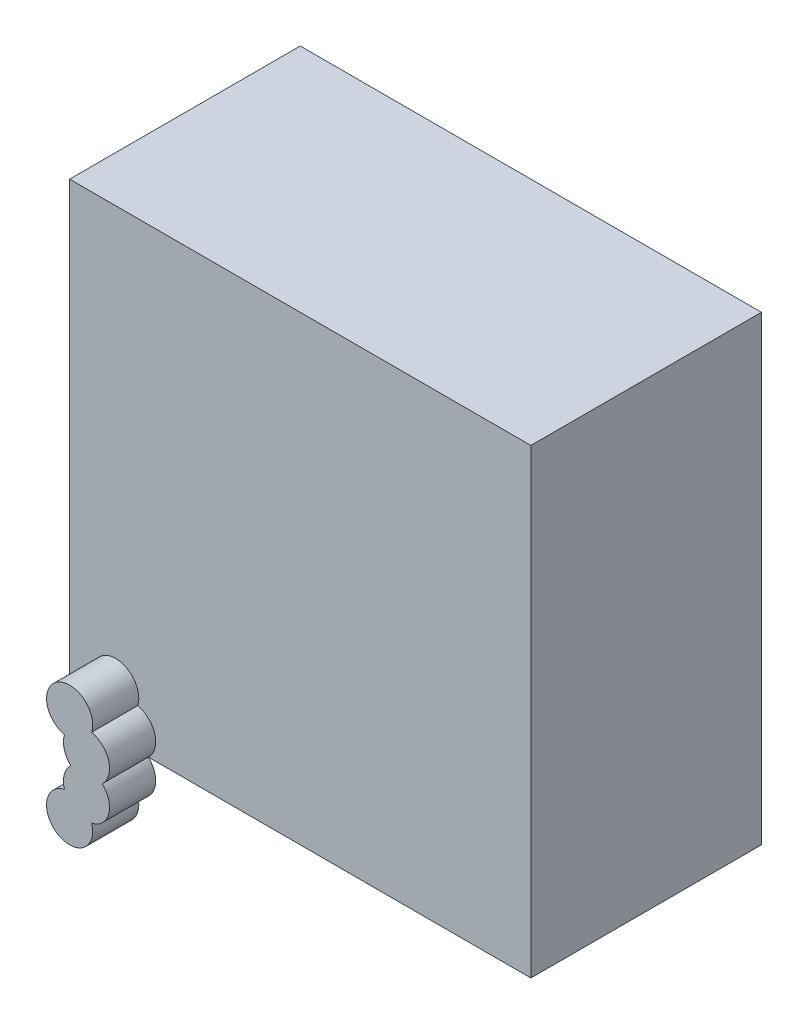
ISO-10303-21;
HEADER;
FILE_DESCRIPTION(('STEP AP214'),'2;1');
FILE_NAME('part.step','',(''),(''),'','','');
FILE_SCHEMA(('AUTOMOTIVE_DESIGN { 1 0 10303 214 1 1 1 1 }'));
ENDSEC;
DATA;
#1=APPLICATION_CONTEXT('core data for automotive mechanical design processes');
#2=APPLICATION_PROTOCOL_DEFINITION('international standard','automotive_design',2000,#1);
#3=PRODUCT_CONTEXT('',#1,'mechanical');
#4=PRODUCT('Part','Part','',(#3));
#5=PRODUCT_RELATED_PRODUCT_CATEGORY('part','',(#4));
#6=PRODUCT_DEFINITION_FORMATION('','',#4);
#7=PRODUCT_DEFINITION_CONTEXT('part definition',#1,'design');
#8=PRODUCT_DEFINITION('design','',#6,#7);
#9=PRODUCT_DEFINITION_SHAPE('','',#8);
#10=(LENGTH_UNIT() NAMED_UNIT(*) SI_UNIT(.MILLI.,.METRE.));
#11=(NAMED_UNIT(*) PLANE_ANGLE_UNIT() SI_UNIT($,.RADIAN.));
#12=(NAMED_UNIT(*) SI_UNIT($,.STERADIAN.) SOLID_ANGLE_UNIT());
#13=UNCERTAINTY_MEASURE_WITH_UNIT(LENGTH_MEASURE(1.E-05),#10,'distance_accuracy_value','');
#14=(GEOMETRIC_REPRESENTATION_CONTEXT(3) GLOBAL_UNCERTAINTY_ASSIGNED_CONTEXT((#13)) GLOBAL_UNIT_ASSIGNED_CONTEXT((#10,
#11,#12)) REPRESENTATION_CONTEXT('',''));
#15=CARTESIAN_POINT('',(0.,0.,0.));
#16=DIRECTION('',(0.,0.,1.));
#17=DIRECTION('',(1.,0.,0.));
#18=AXIS2_PLACEMENT_3D('',#15,#16,#17);
#19=CARTESIAN_POINT('',(2.,2.,12.));
#20=DIRECTION('',(0.,0.,-1.));
#21=DIRECTION('',(-1.,0.,0.));
#22=AXIS2_PLACEMENT_3D('',#19,#20,#21);
#23=CYLINDRICAL_SURFACE('',#22,1.);
#24=DIRECTION('',(0.,0.,-1.));
#25=VECTOR('',#24,1.);
#26=CARTESIAN_POINT('',(1.77604556399895,1.02540038446783,11.));
#27=LINE('',#26,#25);
#28=CARTESIAN_POINT('',(1.77604556399895,1.02540038446783,12.));
#29=VERTEX_POINT('',#28);
#30=CARTESIAN_POINT('',(1.77604556399895,1.02540038446783,10.));
#31=VERTEX_POINT('',#30);
#32=EDGE_CURVE('E170',#29,#31,#27,.T.);
#33=ORIENTED_EDGE('',*,*,#32,.F.);
#34=CARTESIAN_POINT('',(2.,2.,12.));
#35=DIRECTION('',(0.,0.,1.));
#36=DIRECTION('',(1.,0.,0.));
#37=AXIS2_PLACEMENT_3D('',#34,#35,#36);
#38=CIRCLE('',#37,1.);
#39=CARTESIAN_POINT('',(2.95600524356993,1.70665042310105,12.));
#40=VERTEX_POINT('',#39);
#41=EDGE_CURVE('E168',#40,#29,#38,.T.);
#42=ORIENTED_EDGE('',*,*,#41,.F.);
#43=DIRECTION('',(0.,0.,-1.));
#44=VECTOR('',#43,1.);
#45=CARTESIAN_POINT('',(2.95600524356993,1.70665042310105,11.));
#46=LINE('',#45,#44);
#47=CARTESIAN_POINT('',(2.95600524356993,1.70665042310105,10.));
#48=VERTEX_POINT('',#47);
#49=EDGE_CURVE('E165',#48,#40,#46,.F.);
#50=ORIENTED_EDGE('',*,*,#49,.F.);
#51=CARTESIAN_POINT('',(2.,2.,10.));
#52=DIRECTION('',(0.,0.,1.));
#53=DIRECTION('',(1.,0.,0.));
#54=AXIS2_PLACEMENT_3D('',#51,#52,#53);
#55=CIRCLE('',#54,1.);
#56=EDGE_CURVE('E11',#48,#31,#55,.T.);
#57=ORIENTED_EDGE('',*,*,#56,.T.);
#58=EDGE_LOOP('',(#33,#42,#50,#57));
#59=FACE_BOUND('',#58,.T.);
#60=ADVANCED_FACE('F45',(#59),#23,.T.);
#61=CARTESIAN_POINT('',(0.,0.,10.));
#62=DIRECTION('',(1.,0.,0.));
#63=DIRECTION('',(0.,0.,-1.));
#64=AXIS2_PLACEMENT_3D('',#61,#62,#63);
#65=PLANE('',#64);
#66=DIRECTION('',(0.,-1.,0.));
#67=VECTOR('',#66,1.);
#68=CARTESIAN_POINT('',(0.,0.,0.));
#69=LINE('',#68,#67);
#70=CARTESIAN_POINT('',(0.,20.,0.));
#71=VERTEX_POINT('',#70);
#72=CARTESIAN_POINT('',(0.,0.,0.));
#73=VERTEX_POINT('',#72);
#74=EDGE_CURVE('E171',#71,#73,#69,.T.);
#75=ORIENTED_EDGE('',*,*,#74,.T.);
#76=DIRECTION('',(0.,0.,-1.));
#77=VECTOR('',#76,1.);
#78=CARTESIAN_POINT('',(0.,0.,10.));
#79=LINE('',#78,#77);
#80=CARTESIAN_POINT('',(0.,0.,10.));
#81=VERTEX_POINT('',#80);
#82=EDGE_CURVE('E46',#81,#73,#79,.T.);
#83=ORIENTED_EDGE('',*,*,#82,.F.);
#84=DIRECTION('',(0.,-1.,0.));
#85=VECTOR('',#84,1.);
#86=CARTESIAN_POINT('',(0.,0.,10.));
#87=LINE('',#86,#85);
#88=CARTESIAN_POINT('',(0.,20.,10.));
#89=VERTEX_POINT('',#88);
#90=EDGE_CURVE('E174',#89,#81,#87,.T.);
#91=ORIENTED_EDGE('',*,*,#90,.F.);
#92=DIRECTION('',(0.,0.,-1.));
#93=VECTOR('',#92,1.);
#94=CARTESIAN_POINT('',(0.,20.,10.));
#95=LINE('',#94,#93);
#96=EDGE_CURVE('E184',#89,#71,#95,.T.);
#97=ORIENTED_EDGE('',*,*,#96,.T.);
#98=EDGE_LOOP('',(#75,#83,#91,#97));
#99=FACE_BOUND('',#98,.T.);
#100=ADVANCED_FACE('F42',(#99),#65,.F.);
#101=CARTESIAN_POINT('',(0.,0.,10.));
#102=DIRECTION('',(0.,1.,0.));
#103=DIRECTION('',(0.,0.,1.));
#104=AXIS2_PLACEMENT_3D('',#101,#102,#103);
#105=PLANE('',#104);
#106=DIRECTION('',(1.,0.,0.));
#107=VECTOR('',#106,1.);
#108=CARTESIAN_POINT('',(0.,0.,0.));
#109=LINE('',#108,#107);
#110=CARTESIAN_POINT('',(20.,0.,0.));
#111=VERTEX_POINT('',#110);
#112=EDGE_CURVE('E189',#73,#111,#109,.T.);
#113=ORIENTED_EDGE('',*,*,#112,.T.);
#114=DIRECTION('',(0.,0.,-1.));
#115=VECTOR('',#114,1.);
#116=CARTESIAN_POINT('',(20.,0.,10.));
#117=LINE('',#116,#115);
#118=CARTESIAN_POINT('',(20.,0.,10.));
#119=VERTEX_POINT('',#118);
#120=EDGE_CURVE('E198',#119,#111,#117,.T.);
#121=ORIENTED_EDGE('',*,*,#120,.F.);
#122=DIRECTION('',(1.,0.,0.));
#123=VECTOR('',#122,1.);
#124=CARTESIAN_POINT('',(0.,0.,10.));
#125=LINE('',#124,#123);
#126=CARTESIAN_POINT('',(3.41330084620209,0.,10.));
#127=VERTEX_POINT('',#126);
#128=EDGE_CURVE('E176',#127,#119,#125,.T.);
#129=ORIENTED_EDGE('',*,*,#128,.F.);
#130=CARTESIAN_POINT('',(2.05080076893566,0.,10.));
#131=VERTEX_POINT('',#130);
#132=EDGE_CURVE('E65',#131,#127,#125,.T.);
#133=ORIENTED_EDGE('',*,*,#132,.F.);
#134=EDGE_CURVE('E178',#81,#131,#125,.T.);
#135=ORIENTED_EDGE('',*,*,#134,.F.);
#136=ORIENTED_EDGE('',*,*,#82,.T.);
#137=EDGE_LOOP('',(#113,#121,#129,#133,#135,#136));
#138=FACE_BOUND('',#137,.T.);
#139=ADVANCED_FACE('F204',(#138),#105,.F.);
#140=CARTESIAN_POINT('',(20.,0.,10.));
#141=DIRECTION('',(-1.,0.,0.));
#142=DIRECTION('',(0.,0.,1.));
#143=AXIS2_PLACEMENT_3D('',#140,#141,#142);
#144=PLANE('',#143);
#145=DIRECTION('',(0.,1.,0.));
#146=VECTOR('',#145,1.);
#147=CARTESIAN_POINT('',(20.,0.,0.));
#148=LINE('',#147,#146);
#149=CARTESIAN_POINT('',(20.,20.,0.));
#150=VERTEX_POINT('',#149);
#151=EDGE_CURVE('E190',#111,#150,#148,.T.);
#152=ORIENTED_EDGE('',*,*,#151,.T.);
#153=DIRECTION('',(0.,0.,-1.));
#154=VECTOR('',#153,1.);
#155=CARTESIAN_POINT('',(20.,20.,10.));
#156=LINE('',#155,#154);
#157=CARTESIAN_POINT('',(20.,20.,10.));
#158=VERTEX_POINT('',#157);
#159=EDGE_CURVE('E194',#158,#150,#156,.T.);
#160=ORIENTED_EDGE('',*,*,#159,.F.);
#161=DIRECTION('',(0.,1.,0.));
#162=VECTOR('',#161,1.);
#163=CARTESIAN_POINT('',(20.,0.,10.));
#164=LINE('',#163,#162);
#165=EDGE_CURVE('E179',#119,#158,#164,.T.);
#166=ORIENTED_EDGE('',*,*,#165,.F.);
#167=ORIENTED_EDGE('',*,*,#120,.T.);
#168=EDGE_LOOP('',(#152,#160,#166,#167));
#169=FACE_BOUND('',#168,.T.);
#170=ADVANCED_FACE('F213',(#169),#144,.F.);
#171=CARTESIAN_POINT('',(0.,20.,10.));
#172=DIRECTION('',(0.,-1.,0.));
#173=DIRECTION('',(0.,0.,-1.));
#174=AXIS2_PLACEMENT_3D('',#171,#172,#173);
#175=PLANE('',#174);
#176=DIRECTION('',(-1.,0.,0.));
#177=VECTOR('',#176,1.);
#178=CARTESIAN_POINT('',(0.,20.,0.));
#179=LINE('',#178,#177);
#180=EDGE_CURVE('E180',#150,#71,#179,.T.);
#181=ORIENTED_EDGE('',*,*,#180,.T.);
#182=ORIENTED_EDGE('',*,*,#96,.F.);
#183=DIRECTION('',(-1.,0.,0.));
#184=VECTOR('',#183,1.);
#185=CARTESIAN_POINT('',(0.,20.,10.));
#186=LINE('',#185,#184);
#187=EDGE_CURVE('E185',#158,#89,#186,.T.);
#188=ORIENTED_EDGE('',*,*,#187,.F.);
#189=ORIENTED_EDGE('',*,*,#159,.T.);
#190=EDGE_LOOP('',(#181,#182,#188,#189));
#191=FACE_BOUND('',#190,.T.);
#192=ADVANCED_FACE('F216',(#191),#175,.F.);
#193=CARTESIAN_POINT('',(0.,0.,10.));
#194=DIRECTION('',(0.,0.,-1.));
#195=DIRECTION('',(-1.,0.,0.));
#196=AXIS2_PLACEMENT_3D('',#193,#194,#195);
#197=PLANE('',#196);
#198=CARTESIAN_POINT('',(2.73205080756888,0.732050807568878,10.));
#199=DIRECTION('',(0.,0.,1.));
#200=DIRECTION('',(0.866025403784439,-0.5,0.));
#201=AXIS2_PLACEMENT_3D('',#198,#199,#200);
#202=CIRCLE('',#201,1.);
#203=EDGE_CURVE('E59',#127,#48,#202,.T.);
#204=ORIENTED_EDGE('',*,*,#203,.F.);
#205=ORIENTED_EDGE('',*,*,#128,.T.);
#206=ORIENTED_EDGE('',*,*,#165,.T.);
#207=ORIENTED_EDGE('',*,*,#187,.T.);
#208=ORIENTED_EDGE('',*,*,#90,.T.);
#209=ORIENTED_EDGE('',*,*,#134,.T.);
#210=EDGE_CURVE('E157',#31,#131,#202,.T.);
#211=ORIENTED_EDGE('',*,*,#210,.F.);
#212=ORIENTED_EDGE('',*,*,#56,.F.);
#213=EDGE_LOOP('',(#204,#205,#206,#207,#208,#209,#211,#212));
#214=FACE_BOUND('',#213,.T.);
#215=ADVANCED_FACE('F220',(#214),#197,.F.);
#216=CARTESIAN_POINT('',(0.,0.,0.));
#217=DIRECTION('',(0.,0.,-1.));
#218=DIRECTION('',(-1.,0.,0.));
#219=AXIS2_PLACEMENT_3D('',#216,#217,#218);
#220=PLANE('',#219);
#221=ORIENTED_EDGE('',*,*,#74,.F.);
#222=ORIENTED_EDGE('',*,*,#180,.F.);
#223=ORIENTED_EDGE('',*,*,#151,.F.);
#224=ORIENTED_EDGE('',*,*,#112,.F.);
#225=EDGE_LOOP('',(#221,#222,#223,#224));
#226=FACE_BOUND('',#225,.T.);
#227=ADVANCED_FACE('F211',(#226),#220,.T.);
#228=CARTESIAN_POINT('',(2.,2.,12.));
#229=DIRECTION('',(0.,0.,1.));
#230=DIRECTION('',(1.,0.,0.));
#231=AXIS2_PLACEMENT_3D('',#228,#229,#230);
#232=PLANE('',#231);
#233=ORIENTED_EDGE('',*,*,#41,.T.);
#234=CARTESIAN_POINT('',(2.73205080756888,0.732050807568878,12.));
#235=DIRECTION('',(0.,0.,1.));
#236=DIRECTION('',(0.866025403784439,-0.5,0.));
#237=AXIS2_PLACEMENT_3D('',#234,#235,#236);
#238=CIRCLE('',#237,1.);
#239=CARTESIAN_POINT('',(2.05080076893566,0.,12.));
#240=VERTEX_POINT('',#239);
#241=EDGE_CURVE('E162',#29,#240,#238,.T.);
#242=ORIENTED_EDGE('',*,*,#241,.T.);
#243=CARTESIAN_POINT('',(2.73205080756888,-0.732050807568877,12.));
#244=DIRECTION('',(0.,0.,1.));
#245=DIRECTION('',(0.5,-0.866025403784439,0.));
#246=AXIS2_PLACEMENT_3D('',#243,#244,#245);
#247=CIRCLE('',#246,1.);
#248=CARTESIAN_POINT('',(1.77604556399895,-1.02540038446783,12.));
#249=VERTEX_POINT('',#248);
#250=EDGE_CURVE('E134',#240,#249,#247,.T.);
#251=ORIENTED_EDGE('',*,*,#250,.T.);
#252=CARTESIAN_POINT('',(2.,-2.,12.));
#253=DIRECTION('',(0.,0.,1.));
#254=DIRECTION('',(0.,-1.,0.));
#255=AXIS2_PLACEMENT_3D('',#252,#253,#254);
#256=CIRCLE('',#255,1.);
#257=CARTESIAN_POINT('',(2.95600524356993,-1.70665042310104,12.));
#258=VERTEX_POINT('',#257);
#259=EDGE_CURVE('E139',#249,#258,#256,.T.);
#260=ORIENTED_EDGE('',*,*,#259,.T.);
#261=CARTESIAN_POINT('',(3.41330084620209,0.,12.));
#262=VERTEX_POINT('',#261);
#263=EDGE_CURVE('E121',#258,#262,#247,.T.);
#264=ORIENTED_EDGE('',*,*,#263,.T.);
#265=EDGE_CURVE('E159',#262,#40,#238,.T.);
#266=ORIENTED_EDGE('',*,*,#265,.T.);
#267=EDGE_LOOP('',(#233,#242,#251,#260,#264,#266));
#268=FACE_BOUND('',#267,.T.);
#269=ADVANCED_FACE('F144',(#268),#232,.T.);
#270=CARTESIAN_POINT('',(2.73205080756888,0.732050807568878,12.));
#271=DIRECTION('',(0.,0.,-1.));
#272=DIRECTION('',(-1.,0.,0.));
#273=AXIS2_PLACEMENT_3D('',#270,#271,#272);
#274=CYLINDRICAL_SURFACE('',#273,1.);
#275=ORIENTED_EDGE('',*,*,#241,.F.);
#276=ORIENTED_EDGE('',*,*,#32,.T.);
#277=ORIENTED_EDGE('',*,*,#210,.T.);
#278=DIRECTION('',(0.,0.,-1.));
#279=VECTOR('',#278,1.);
#280=CARTESIAN_POINT('',(2.05080076893566,0.,11.));
#281=LINE('',#280,#279);
#282=EDGE_CURVE('E156',#240,#131,#281,.T.);
#283=ORIENTED_EDGE('',*,*,#282,.F.);
#284=EDGE_LOOP('',(#275,#276,#277,#283));
#285=FACE_BOUND('',#284,.T.);
#286=ADVANCED_FACE('F227',(#285),#274,.T.);
#287=ORIENTED_EDGE('',*,*,#203,.T.);
#288=ORIENTED_EDGE('',*,*,#49,.T.);
#289=ORIENTED_EDGE('',*,*,#265,.F.);
#290=DIRECTION('',(0.,0.,-1.));
#291=VECTOR('',#290,1.);
#292=CARTESIAN_POINT('',(3.41330084620209,0.,11.));
#293=LINE('',#292,#291);
#294=EDGE_CURVE('E126',#127,#262,#293,.F.);
#295=ORIENTED_EDGE('',*,*,#294,.F.);
#296=EDGE_LOOP('',(#287,#288,#289,#295));
#297=FACE_BOUND('',#296,.T.);
#298=ADVANCED_FACE('F225',(#297),#274,.T.);
#299=CARTESIAN_POINT('',(2.73205080756888,0.732050807568878,10.));
#300=DIRECTION('',(0.,0.,1.));
#301=DIRECTION('',(0.866025403784439,-0.5,0.));
#302=AXIS2_PLACEMENT_3D('',#299,#300,#301);
#303=PLANE('',#302);
#304=CARTESIAN_POINT('',(2.73205080756888,-0.732050807568877,10.));
#305=DIRECTION('',(0.,0.,1.));
#306=DIRECTION('',(0.5,-0.866025403784439,0.));
#307=AXIS2_PLACEMENT_3D('',#304,#305,#306);
#308=CIRCLE('',#307,1.);
#309=CARTESIAN_POINT('',(1.77604556399895,-1.02540038446783,10.));
#310=VERTEX_POINT('',#309);
#311=EDGE_CURVE('E151',#131,#310,#308,.T.);
#312=ORIENTED_EDGE('',*,*,#311,.F.);
#313=ORIENTED_EDGE('',*,*,#132,.T.);
#314=CARTESIAN_POINT('',(2.95600524356993,-1.70665042310104,10.));
#315=VERTEX_POINT('',#314);
#316=EDGE_CURVE('E153',#315,#127,#308,.T.);
#317=ORIENTED_EDGE('',*,*,#316,.F.);
#318=CARTESIAN_POINT('',(2.,-2.,10.));
#319=DIRECTION('',(0.,0.,1.));
#320=DIRECTION('',(0.,-1.,0.));
#321=AXIS2_PLACEMENT_3D('',#318,#319,#320);
#322=CIRCLE('',#321,1.);
#323=EDGE_CURVE('E143',#310,#315,#322,.T.);
#324=ORIENTED_EDGE('',*,*,#323,.F.);
#325=EDGE_LOOP('',(#312,#313,#317,#324));
#326=FACE_BOUND('',#325,.T.);
#327=ADVANCED_FACE('F219',(#326),#303,.F.);
#328=CARTESIAN_POINT('',(2.73205080756888,-0.732050807568877,12.));
#329=DIRECTION('',(0.,0.,-1.));
#330=DIRECTION('',(-1.,0.,0.));
#331=AXIS2_PLACEMENT_3D('',#328,#329,#330);
#332=CYLINDRICAL_SURFACE('',#331,1.);
#333=ORIENTED_EDGE('',*,*,#250,.F.);
#334=ORIENTED_EDGE('',*,*,#282,.T.);
#335=ORIENTED_EDGE('',*,*,#311,.T.);
#336=DIRECTION('',(0.,0.,-1.));
#337=VECTOR('',#336,1.);
#338=CARTESIAN_POINT('',(1.77604556399895,-1.02540038446783,11.));
#339=LINE('',#338,#337);
#340=EDGE_CURVE('E142',#249,#310,#339,.T.);
#341=ORIENTED_EDGE('',*,*,#340,.F.);
#342=EDGE_LOOP('',(#333,#334,#335,#341));
#343=FACE_BOUND('',#342,.T.);
#344=ADVANCED_FACE('F230',(#343),#332,.T.);
#345=ORIENTED_EDGE('',*,*,#316,.T.);
#346=ORIENTED_EDGE('',*,*,#294,.T.);
#347=ORIENTED_EDGE('',*,*,#263,.F.);
#348=DIRECTION('',(0.,0.,-1.));
#349=VECTOR('',#348,1.);
#350=CARTESIAN_POINT('',(2.95600524356993,-1.70665042310104,11.));
#351=LINE('',#350,#349);
#352=EDGE_CURVE('E124',#315,#258,#351,.F.);
#353=ORIENTED_EDGE('',*,*,#352,.F.);
#354=EDGE_LOOP('',(#345,#346,#347,#353));
#355=FACE_BOUND('',#354,.T.);
#356=ADVANCED_FACE('F122',(#355),#332,.T.);
#357=CARTESIAN_POINT('',(2.,-2.,12.));
#358=DIRECTION('',(0.,0.,-1.));
#359=DIRECTION('',(-1.,0.,0.));
#360=AXIS2_PLACEMENT_3D('',#357,#358,#359);
#361=CYLINDRICAL_SURFACE('',#360,1.);
#362=ORIENTED_EDGE('',*,*,#259,.F.);
#363=ORIENTED_EDGE('',*,*,#340,.T.);
#364=ORIENTED_EDGE('',*,*,#323,.T.);
#365=ORIENTED_EDGE('',*,*,#352,.T.);
#366=EDGE_LOOP('',(#362,#363,#364,#365));
#367=FACE_BOUND('',#366,.T.);
#368=ADVANCED_FACE('F140',(#367),#361,.T.);
#369=CLOSED_SHELL('',(#60,#100,#139,#170,#192,#215,#227,#269,#286,#298,#327,#344,#356,#368));
#370=MANIFOLD_SOLID_BREP('B2',#369);
#371=ADVANCED_BREP_SHAPE_REPRESENTATION('',(#18,#370),#14);
#372=SHAPE_DEFINITION_REPRESENTATION(#9,#371);
ENDSEC;
END-ISO-10303-21;
